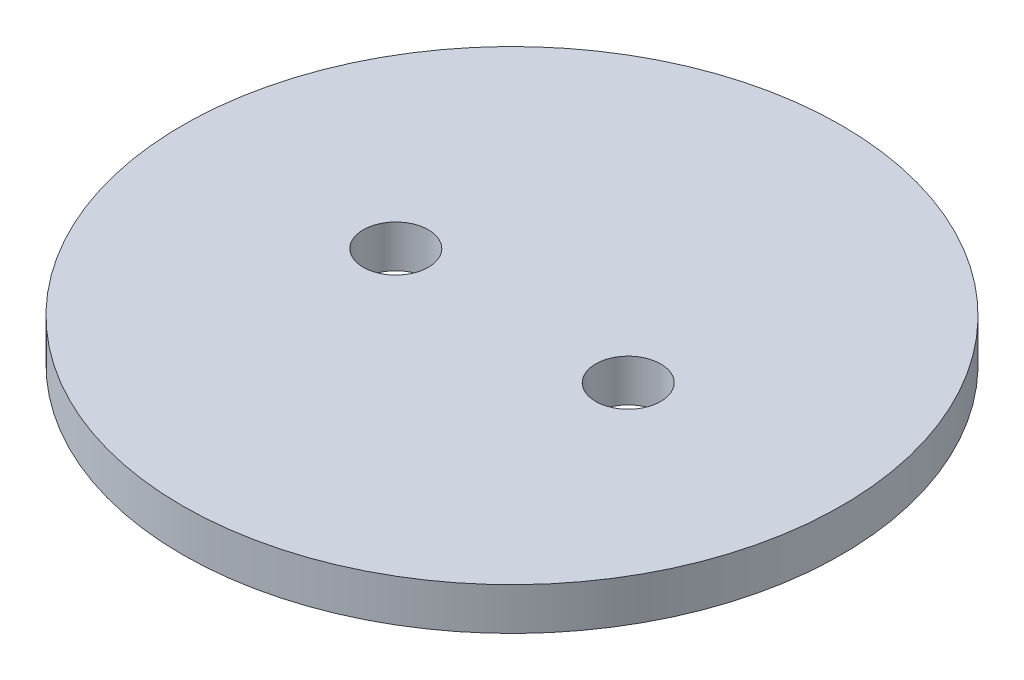
ISO-10303-21;
HEADER;
FILE_DESCRIPTION(('STEP AP214'),'2;1');
FILE_NAME('part.step','',(''),(''),'','','');
FILE_SCHEMA(('AUTOMOTIVE_DESIGN { 1 0 10303 214 1 1 1 1 }'));
ENDSEC;
DATA;
#1=APPLICATION_CONTEXT('core data for automotive mechanical design processes');
#2=APPLICATION_PROTOCOL_DEFINITION('international standard','automotive_design',2000,#1);
#3=PRODUCT_CONTEXT('',#1,'mechanical');
#4=PRODUCT('Part','Part','',(#3));
#5=PRODUCT_RELATED_PRODUCT_CATEGORY('part','',(#4));
#6=PRODUCT_DEFINITION_FORMATION('','',#4);
#7=PRODUCT_DEFINITION_CONTEXT('part definition',#1,'design');
#8=PRODUCT_DEFINITION('design','',#6,#7);
#9=PRODUCT_DEFINITION_SHAPE('','',#8);
#10=(LENGTH_UNIT() NAMED_UNIT(*) SI_UNIT(.MILLI.,.METRE.));
#11=(NAMED_UNIT(*) PLANE_ANGLE_UNIT() SI_UNIT($,.RADIAN.));
#12=(NAMED_UNIT(*) SI_UNIT($,.STERADIAN.) SOLID_ANGLE_UNIT());
#13=UNCERTAINTY_MEASURE_WITH_UNIT(LENGTH_MEASURE(1.E-05),#10,'distance_accuracy_value','');
#14=(GEOMETRIC_REPRESENTATION_CONTEXT(3) GLOBAL_UNCERTAINTY_ASSIGNED_CONTEXT((#13)) GLOBAL_UNIT_ASSIGNED_CONTEXT((#10,
#11,#12)) REPRESENTATION_CONTEXT('',''));
#15=CARTESIAN_POINT('',(0.,0.,0.));
#16=DIRECTION('',(0.,0.,1.));
#17=DIRECTION('',(1.,0.,0.));
#18=AXIS2_PLACEMENT_3D('',#15,#16,#17);
#19=CARTESIAN_POINT('',(0.,6.35,0.));
#20=DIRECTION('',(0.,-1.,0.));
#21=DIRECTION('',(0.,0.,-1.));
#22=AXIS2_PLACEMENT_3D('',#19,#20,#21);
#23=CYLINDRICAL_SURFACE('',#22,49.53);
#24=CARTESIAN_POINT('',(0.,6.35,0.));
#25=DIRECTION('',(0.,1.,0.));
#26=DIRECTION('',(0.,0.,1.));
#27=AXIS2_PLACEMENT_3D('',#24,#25,#26);
#28=CIRCLE('',#27,49.53);
#29=CARTESIAN_POINT('',(0.,6.35,49.53));
#30=VERTEX_POINT('',#29);
#31=EDGE_CURVE('E10',#30,#30,#28,.T.);
#32=ORIENTED_EDGE('',*,*,#31,.F.);
#33=EDGE_LOOP('',(#32));
#34=FACE_BOUND('',#33,.T.);
#35=CARTESIAN_POINT('',(0.,0.,0.));
#36=DIRECTION('',(0.,1.,0.));
#37=DIRECTION('',(0.,0.,1.));
#38=AXIS2_PLACEMENT_3D('',#35,#36,#37);
#39=CIRCLE('',#38,49.53);
#40=CARTESIAN_POINT('',(0.,0.,49.53));
#41=VERTEX_POINT('',#40);
#42=EDGE_CURVE('E46',#41,#41,#39,.T.);
#43=ORIENTED_EDGE('',*,*,#42,.T.);
#44=EDGE_LOOP('',(#43));
#45=FACE_BOUND('',#44,.T.);
#46=ADVANCED_FACE('F43',(#34,#45),#23,.T.);
#47=CARTESIAN_POINT('',(0.,6.35,0.));
#48=DIRECTION('',(0.,1.,0.));
#49=DIRECTION('',(0.,0.,1.));
#50=AXIS2_PLACEMENT_3D('',#47,#48,#49);
#51=PLANE('',#50);
#52=CARTESIAN_POINT('',(-17.4625,6.35,0.));
#53=DIRECTION('',(0.,1.,0.));
#54=DIRECTION('',(0.,0.,1.));
#55=AXIS2_PLACEMENT_3D('',#52,#53,#54);
#56=CIRCLE('',#55,4.8895);
#57=CARTESIAN_POINT('',(-17.4625,6.35,4.8895));
#58=VERTEX_POINT('',#57);
#59=EDGE_CURVE('E61',#58,#58,#56,.T.);
#60=ORIENTED_EDGE('',*,*,#59,.F.);
#61=EDGE_LOOP('',(#60));
#62=FACE_BOUND('',#61,.T.);
#63=CARTESIAN_POINT('',(17.4625,6.35,0.));
#64=DIRECTION('',(0.,1.,0.));
#65=DIRECTION('',(0.,0.,1.));
#66=AXIS2_PLACEMENT_3D('',#63,#64,#65);
#67=CIRCLE('',#66,4.8895);
#68=CARTESIAN_POINT('',(17.4625,6.35,4.8895));
#69=VERTEX_POINT('',#68);
#70=EDGE_CURVE('E62',#69,#69,#67,.T.);
#71=ORIENTED_EDGE('',*,*,#70,.F.);
#72=EDGE_LOOP('',(#71));
#73=FACE_BOUND('',#72,.T.);
#74=ORIENTED_EDGE('',*,*,#31,.T.);
#75=EDGE_LOOP('',(#74));
#76=FACE_BOUND('',#75,.T.);
#77=ADVANCED_FACE('F81',(#62,#73,#76),#51,.T.);
#78=CARTESIAN_POINT('',(0.,0.,0.));
#79=DIRECTION('',(0.,1.,0.));
#80=DIRECTION('',(0.,0.,1.));
#81=AXIS2_PLACEMENT_3D('',#78,#79,#80);
#82=PLANE('',#81);
#83=CARTESIAN_POINT('',(-17.4625,0.,0.));
#84=DIRECTION('',(0.,1.,0.));
#85=DIRECTION('',(0.,0.,1.));
#86=AXIS2_PLACEMENT_3D('',#83,#84,#85);
#87=CIRCLE('',#86,4.8895);
#88=CARTESIAN_POINT('',(-17.4625,0.,4.8895));
#89=VERTEX_POINT('',#88);
#90=EDGE_CURVE('E54',#89,#89,#87,.T.);
#91=ORIENTED_EDGE('',*,*,#90,.T.);
#92=EDGE_LOOP('',(#91));
#93=FACE_BOUND('',#92,.T.);
#94=CARTESIAN_POINT('',(17.4625,0.,0.));
#95=DIRECTION('',(0.,1.,0.));
#96=DIRECTION('',(0.,0.,1.));
#97=AXIS2_PLACEMENT_3D('',#94,#95,#96);
#98=CIRCLE('',#97,4.8895);
#99=CARTESIAN_POINT('',(17.4625,0.,4.8895));
#100=VERTEX_POINT('',#99);
#101=EDGE_CURVE('E60',#100,#100,#98,.T.);
#102=ORIENTED_EDGE('',*,*,#101,.T.);
#103=EDGE_LOOP('',(#102));
#104=FACE_BOUND('',#103,.T.);
#105=ORIENTED_EDGE('',*,*,#42,.F.);
#106=EDGE_LOOP('',(#105));
#107=FACE_BOUND('',#106,.T.);
#108=ADVANCED_FACE('F73',(#93,#104,#107),#82,.F.);
#109=CARTESIAN_POINT('',(17.4625,0.,0.));
#110=DIRECTION('',(0.,1.,0.));
#111=DIRECTION('',(0.,0.,1.));
#112=AXIS2_PLACEMENT_3D('',#109,#110,#111);
#113=CYLINDRICAL_SURFACE('',#112,4.8895);
#114=ORIENTED_EDGE('',*,*,#101,.F.);
#115=EDGE_LOOP('',(#114));
#116=FACE_BOUND('',#115,.T.);
#117=ORIENTED_EDGE('',*,*,#70,.T.);
#118=EDGE_LOOP('',(#117));
#119=FACE_BOUND('',#118,.T.);
#120=ADVANCED_FACE('F80',(#116,#119),#113,.F.);
#121=CARTESIAN_POINT('',(-17.4625,0.,0.));
#122=DIRECTION('',(0.,1.,0.));
#123=DIRECTION('',(0.,0.,1.));
#124=AXIS2_PLACEMENT_3D('',#121,#122,#123);
#125=CYLINDRICAL_SURFACE('',#124,4.8895);
#126=ORIENTED_EDGE('',*,*,#90,.F.);
#127=EDGE_LOOP('',(#126));
#128=FACE_BOUND('',#127,.T.);
#129=ORIENTED_EDGE('',*,*,#59,.T.);
#130=EDGE_LOOP('',(#129));
#131=FACE_BOUND('',#130,.T.);
#132=ADVANCED_FACE('F78',(#128,#131),#125,.F.);
#133=CLOSED_SHELL('',(#46,#77,#108,#120,#132));
#134=MANIFOLD_SOLID_BREP('B2',#133);
#135=ADVANCED_BREP_SHAPE_REPRESENTATION('',(#18,#134),#14);
#136=SHAPE_DEFINITION_REPRESENTATION(#9,#135);
ENDSEC;
END-ISO-10303-21;
